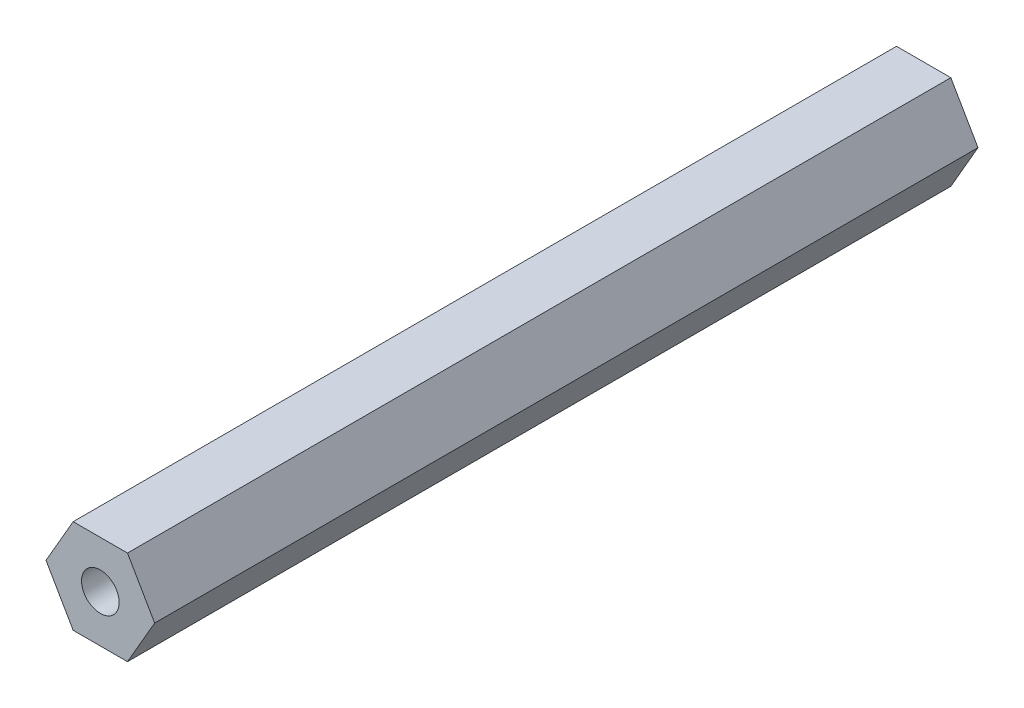
ISO-10303-21;
HEADER;
FILE_DESCRIPTION(('STEP AP214'),'2;1');
FILE_NAME('part.step','',(''),(''),'','','');
FILE_SCHEMA(('AUTOMOTIVE_DESIGN { 1 0 10303 214 1 1 1 1 }'));
ENDSEC;
DATA;
#1=APPLICATION_CONTEXT('core data for automotive mechanical design processes');
#2=APPLICATION_PROTOCOL_DEFINITION('international standard','automotive_design',2000,#1);
#3=PRODUCT_CONTEXT('',#1,'mechanical');
#4=PRODUCT('Part','Part','',(#3));
#5=PRODUCT_RELATED_PRODUCT_CATEGORY('part','',(#4));
#6=PRODUCT_DEFINITION_FORMATION('','',#4);
#7=PRODUCT_DEFINITION_CONTEXT('part definition',#1,'design');
#8=PRODUCT_DEFINITION('design','',#6,#7);
#9=PRODUCT_DEFINITION_SHAPE('','',#8);
#10=(LENGTH_UNIT() NAMED_UNIT(*) SI_UNIT(.MILLI.,.METRE.));
#11=(NAMED_UNIT(*) PLANE_ANGLE_UNIT() SI_UNIT($,.RADIAN.));
#12=(NAMED_UNIT(*) SI_UNIT($,.STERADIAN.) SOLID_ANGLE_UNIT());
#13=UNCERTAINTY_MEASURE_WITH_UNIT(LENGTH_MEASURE(1.E-05),#10,'distance_accuracy_value','');
#14=(GEOMETRIC_REPRESENTATION_CONTEXT(3) GLOBAL_UNCERTAINTY_ASSIGNED_CONTEXT((#13)) GLOBAL_UNIT_ASSIGNED_CONTEXT((#10,
#11,#12)) REPRESENTATION_CONTEXT('',''));
#15=CARTESIAN_POINT('',(0.,0.,0.));
#16=DIRECTION('',(0.,0.,1.));
#17=DIRECTION('',(1.,0.,0.));
#18=AXIS2_PLACEMENT_3D('',#15,#16,#17);
#19=CARTESIAN_POINT('',(0.,0.,111.125));
#20=DIRECTION('',(0.,0.,1.));
#21=DIRECTION('',(1.,0.,0.));
#22=AXIS2_PLACEMENT_3D('',#19,#20,#21);
#23=PLANE('',#22);
#24=DIRECTION('',(0.499999999999995,0.866025403784442,0.));
#25=VECTOR('',#24,1.);
#26=CARTESIAN_POINT('',(3.6661742093542,-6.91158159854264,111.125));
#27=LINE('',#26,#25);
#28=CARTESIAN_POINT('',(3.6661742093542,-6.91158159854264,111.125));
#29=VERTEX_POINT('',#28);
#30=CARTESIAN_POINT('',(7.33234841870825,-0.561581598542684,111.125));
#31=VERTEX_POINT('',#30);
#32=EDGE_CURVE('E150',#29,#31,#27,.T.);
#33=ORIENTED_EDGE('',*,*,#32,.T.);
#34=DIRECTION('',(-0.500000000000001,0.866025403784438,0.));
#35=VECTOR('',#34,1.);
#36=CARTESIAN_POINT('',(7.33234841870825,-0.561581598542684,111.125));
#37=LINE('',#36,#35);
#38=CARTESIAN_POINT('',(3.66617420935411,5.78841840145733,111.125));
#39=VERTEX_POINT('',#38);
#40=EDGE_CURVE('E98',#31,#39,#37,.T.);
#41=ORIENTED_EDGE('',*,*,#40,.T.);
#42=DIRECTION('',(-1.,0.,0.));
#43=VECTOR('',#42,1.);
#44=CARTESIAN_POINT('',(3.66617420935411,5.78841840145733,111.125));
#45=LINE('',#44,#43);
#46=CARTESIAN_POINT('',(-3.66617420935416,5.7884184014573,111.125));
#47=VERTEX_POINT('',#46);
#48=EDGE_CURVE('E111',#39,#47,#45,.T.);
#49=ORIENTED_EDGE('',*,*,#48,.T.);
#50=DIRECTION('',(-0.499999999999995,-0.866025403784442,0.));
#51=VECTOR('',#50,1.);
#52=CARTESIAN_POINT('',(-3.66617420935416,5.7884184014573,111.125));
#53=LINE('',#52,#51);
#54=CARTESIAN_POINT('',(-7.33234841870825,-0.561581598542735,111.125));
#55=VERTEX_POINT('',#54);
#56=EDGE_CURVE('E105',#47,#55,#53,.T.);
#57=ORIENTED_EDGE('',*,*,#56,.T.);
#58=DIRECTION('',(0.500000000000007,-0.866025403784434,0.));
#59=VECTOR('',#58,1.);
#60=CARTESIAN_POINT('',(-7.33234841870825,-0.561581598542735,111.125));
#61=LINE('',#60,#59);
#62=CARTESIAN_POINT('',(-3.66617420935407,-6.91158159854272,111.125));
#63=VERTEX_POINT('',#62);
#64=EDGE_CURVE('E109',#55,#63,#61,.T.);
#65=ORIENTED_EDGE('',*,*,#64,.T.);
#66=DIRECTION('',(1.,0.,0.));
#67=VECTOR('',#66,1.);
#68=CARTESIAN_POINT('',(-3.66617420935407,-6.91158159854272,111.125));
#69=LINE('',#68,#67);
#70=EDGE_CURVE('E61',#63,#29,#69,.T.);
#71=ORIENTED_EDGE('',*,*,#70,.T.);
#72=EDGE_LOOP('',(#33,#41,#49,#57,#65,#71));
#73=FACE_BOUND('',#72,.T.);
#74=CARTESIAN_POINT('',(0.,-0.561581598542684,111.125));
#75=DIRECTION('',(0.,0.,1.));
#76=DIRECTION('',(1.,0.,0.));
#77=AXIS2_PLACEMENT_3D('',#74,#75,#76);
#78=CIRCLE('',#77,2.54);
#79=CARTESIAN_POINT('',(2.54,-0.561581598542684,111.125));
#80=VERTEX_POINT('',#79);
#81=EDGE_CURVE('E138',#80,#80,#78,.T.);
#82=ORIENTED_EDGE('',*,*,#81,.F.);
#83=EDGE_LOOP('',(#82));
#84=FACE_BOUND('',#83,.T.);
#85=ADVANCED_FACE('F43',(#73,#84),#23,.T.);
#86=CARTESIAN_POINT('',(0.,0.,0.));
#87=DIRECTION('',(0.,0.,1.));
#88=DIRECTION('',(1.,0.,0.));
#89=AXIS2_PLACEMENT_3D('',#86,#87,#88);
#90=PLANE('',#89);
#91=DIRECTION('',(0.499999999999995,0.866025403784442,0.));
#92=VECTOR('',#91,1.);
#93=CARTESIAN_POINT('',(3.6661742093542,-6.91158159854264,0.));
#94=LINE('',#93,#92);
#95=CARTESIAN_POINT('',(3.6661742093542,-6.91158159854264,0.));
#96=VERTEX_POINT('',#95);
#97=CARTESIAN_POINT('',(7.33234841870825,-0.561581598542684,0.));
#98=VERTEX_POINT('',#97);
#99=EDGE_CURVE('E133',#96,#98,#94,.T.);
#100=ORIENTED_EDGE('',*,*,#99,.F.);
#101=DIRECTION('',(1.,0.,0.));
#102=VECTOR('',#101,1.);
#103=CARTESIAN_POINT('',(-3.66617420935407,-6.91158159854272,0.));
#104=LINE('',#103,#102);
#105=CARTESIAN_POINT('',(-3.66617420935407,-6.91158159854272,0.));
#106=VERTEX_POINT('',#105);
#107=EDGE_CURVE('E90',#106,#96,#104,.T.);
#108=ORIENTED_EDGE('',*,*,#107,.F.);
#109=DIRECTION('',(0.500000000000007,-0.866025403784434,0.));
#110=VECTOR('',#109,1.);
#111=CARTESIAN_POINT('',(-7.33234841870825,-0.561581598542735,0.));
#112=LINE('',#111,#110);
#113=CARTESIAN_POINT('',(-7.33234841870825,-0.561581598542735,0.));
#114=VERTEX_POINT('',#113);
#115=EDGE_CURVE('E84',#114,#106,#112,.T.);
#116=ORIENTED_EDGE('',*,*,#115,.F.);
#117=DIRECTION('',(-0.499999999999995,-0.866025403784442,0.));
#118=VECTOR('',#117,1.);
#119=CARTESIAN_POINT('',(-3.66617420935416,5.7884184014573,0.));
#120=LINE('',#119,#118);
#121=CARTESIAN_POINT('',(-3.66617420935416,5.7884184014573,0.));
#122=VERTEX_POINT('',#121);
#123=EDGE_CURVE('E120',#122,#114,#120,.T.);
#124=ORIENTED_EDGE('',*,*,#123,.F.);
#125=DIRECTION('',(-1.,0.,0.));
#126=VECTOR('',#125,1.);
#127=CARTESIAN_POINT('',(3.66617420935411,5.78841840145733,0.));
#128=LINE('',#127,#126);
#129=CARTESIAN_POINT('',(3.66617420935411,5.78841840145733,0.));
#130=VERTEX_POINT('',#129);
#131=EDGE_CURVE('E141',#130,#122,#128,.T.);
#132=ORIENTED_EDGE('',*,*,#131,.F.);
#133=DIRECTION('',(-0.500000000000001,0.866025403784438,0.));
#134=VECTOR('',#133,1.);
#135=CARTESIAN_POINT('',(7.33234841870825,-0.561581598542684,0.));
#136=LINE('',#135,#134);
#137=EDGE_CURVE('E137',#98,#130,#136,.T.);
#138=ORIENTED_EDGE('',*,*,#137,.F.);
#139=EDGE_LOOP('',(#100,#108,#116,#124,#132,#138));
#140=FACE_BOUND('',#139,.T.);
#141=CARTESIAN_POINT('',(0.,-0.561581598542684,0.));
#142=DIRECTION('',(0.,0.,1.));
#143=DIRECTION('',(1.,0.,0.));
#144=AXIS2_PLACEMENT_3D('',#141,#142,#143);
#145=CIRCLE('',#144,2.54);
#146=CARTESIAN_POINT('',(2.54,-0.561581598542684,0.));
#147=VERTEX_POINT('',#146);
#148=EDGE_CURVE('E265',#147,#147,#145,.T.);
#149=ORIENTED_EDGE('',*,*,#148,.T.);
#150=EDGE_LOOP('',(#149));
#151=FACE_BOUND('',#150,.T.);
#152=ADVANCED_FACE('F163',(#140,#151),#90,.F.);
#153=CARTESIAN_POINT('',(3.6661742093542,-6.91158159854264,111.125));
#154=DIRECTION('',(-0.866025403784441,0.499999999999995,0.));
#155=DIRECTION('',(-0.499999999999995,-0.866025403784442,0.));
#156=AXIS2_PLACEMENT_3D('',#153,#154,#155);
#157=PLANE('',#156);
#158=ORIENTED_EDGE('',*,*,#99,.T.);
#159=DIRECTION('',(0.,0.,-1.));
#160=VECTOR('',#159,1.);
#161=CARTESIAN_POINT('',(7.33234841870825,-0.561581598542684,111.125));
#162=LINE('',#161,#160);
#163=EDGE_CURVE('E11',#31,#98,#162,.T.);
#164=ORIENTED_EDGE('',*,*,#163,.F.);
#165=ORIENTED_EDGE('',*,*,#32,.F.);
#166=DIRECTION('',(0.,0.,-1.));
#167=VECTOR('',#166,1.);
#168=CARTESIAN_POINT('',(3.6661742093542,-6.91158159854264,111.125));
#169=LINE('',#168,#167);
#170=EDGE_CURVE('E129',#29,#96,#169,.T.);
#171=ORIENTED_EDGE('',*,*,#170,.T.);
#172=EDGE_LOOP('',(#158,#164,#165,#171));
#173=FACE_BOUND('',#172,.T.);
#174=ADVANCED_FACE('F45',(#173),#157,.F.);
#175=CARTESIAN_POINT('',(7.33234841870825,-0.561581598542684,111.125));
#176=DIRECTION('',(-0.866025403784438,-0.500000000000001,0.));
#177=DIRECTION('',(0.500000000000001,-0.866025403784438,0.));
#178=AXIS2_PLACEMENT_3D('',#175,#176,#177);
#179=PLANE('',#178);
#180=ORIENTED_EDGE('',*,*,#137,.T.);
#181=DIRECTION('',(0.,0.,-1.));
#182=VECTOR('',#181,1.);
#183=CARTESIAN_POINT('',(3.66617420935411,5.78841840145733,111.125));
#184=LINE('',#183,#182);
#185=EDGE_CURVE('E53',#39,#130,#184,.T.);
#186=ORIENTED_EDGE('',*,*,#185,.F.);
#187=ORIENTED_EDGE('',*,*,#40,.F.);
#188=ORIENTED_EDGE('',*,*,#163,.T.);
#189=EDGE_LOOP('',(#180,#186,#187,#188));
#190=FACE_BOUND('',#189,.T.);
#191=ADVANCED_FACE('F188',(#190),#179,.F.);
#192=CARTESIAN_POINT('',(3.66617420935411,5.78841840145733,111.125));
#193=DIRECTION('',(0.,-1.,0.));
#194=DIRECTION('',(1.,0.,0.));
#195=AXIS2_PLACEMENT_3D('',#192,#193,#194);
#196=PLANE('',#195);
#197=ORIENTED_EDGE('',*,*,#131,.T.);
#198=DIRECTION('',(0.,0.,-1.));
#199=VECTOR('',#198,1.);
#200=CARTESIAN_POINT('',(-3.66617420935416,5.7884184014573,111.125));
#201=LINE('',#200,#199);
#202=EDGE_CURVE('E122',#47,#122,#201,.T.);
#203=ORIENTED_EDGE('',*,*,#202,.F.);
#204=ORIENTED_EDGE('',*,*,#48,.F.);
#205=ORIENTED_EDGE('',*,*,#185,.T.);
#206=EDGE_LOOP('',(#197,#203,#204,#205));
#207=FACE_BOUND('',#206,.T.);
#208=ADVANCED_FACE('F160',(#207),#196,.F.);
#209=CARTESIAN_POINT('',(-3.66617420935416,5.7884184014573,111.125));
#210=DIRECTION('',(0.866025403784442,-0.499999999999995,0.));
#211=DIRECTION('',(0.499999999999995,0.866025403784442,0.));
#212=AXIS2_PLACEMENT_3D('',#209,#210,#211);
#213=PLANE('',#212);
#214=ORIENTED_EDGE('',*,*,#123,.T.);
#215=DIRECTION('',(0.,0.,-1.));
#216=VECTOR('',#215,1.);
#217=CARTESIAN_POINT('',(-7.33234841870825,-0.561581598542735,111.125));
#218=LINE('',#217,#216);
#219=EDGE_CURVE('E117',#55,#114,#218,.T.);
#220=ORIENTED_EDGE('',*,*,#219,.F.);
#221=ORIENTED_EDGE('',*,*,#56,.F.);
#222=ORIENTED_EDGE('',*,*,#202,.T.);
#223=EDGE_LOOP('',(#214,#220,#221,#222));
#224=FACE_BOUND('',#223,.T.);
#225=ADVANCED_FACE('F118',(#224),#213,.F.);
#226=CARTESIAN_POINT('',(-7.33234841870825,-0.561581598542735,111.125));
#227=DIRECTION('',(0.866025403784434,0.500000000000007,0.));
#228=DIRECTION('',(-0.500000000000007,0.866025403784435,0.));
#229=AXIS2_PLACEMENT_3D('',#226,#227,#228);
#230=PLANE('',#229);
#231=ORIENTED_EDGE('',*,*,#115,.T.);
#232=DIRECTION('',(0.,0.,-1.));
#233=VECTOR('',#232,1.);
#234=CARTESIAN_POINT('',(-3.66617420935407,-6.91158159854272,111.125));
#235=LINE('',#234,#233);
#236=EDGE_CURVE('E123',#63,#106,#235,.T.);
#237=ORIENTED_EDGE('',*,*,#236,.F.);
#238=ORIENTED_EDGE('',*,*,#64,.F.);
#239=ORIENTED_EDGE('',*,*,#219,.T.);
#240=EDGE_LOOP('',(#231,#237,#238,#239));
#241=FACE_BOUND('',#240,.T.);
#242=ADVANCED_FACE('F125',(#241),#230,.F.);
#243=CARTESIAN_POINT('',(-3.66617420935407,-6.91158159854272,111.125));
#244=DIRECTION('',(0.,1.,0.));
#245=DIRECTION('',(-1.,0.,0.));
#246=AXIS2_PLACEMENT_3D('',#243,#244,#245);
#247=PLANE('',#246);
#248=ORIENTED_EDGE('',*,*,#107,.T.);
#249=ORIENTED_EDGE('',*,*,#170,.F.);
#250=ORIENTED_EDGE('',*,*,#70,.F.);
#251=ORIENTED_EDGE('',*,*,#236,.T.);
#252=EDGE_LOOP('',(#248,#249,#250,#251));
#253=FACE_BOUND('',#252,.T.);
#254=ADVANCED_FACE('F168',(#253),#247,.F.);
#255=CARTESIAN_POINT('',(0.,-0.561581598542684,111.125));
#256=DIRECTION('',(0.,0.,-1.));
#257=DIRECTION('',(-1.,0.,0.));
#258=AXIS2_PLACEMENT_3D('',#255,#256,#257);
#259=CYLINDRICAL_SURFACE('',#258,2.54);
#260=ORIENTED_EDGE('',*,*,#81,.T.);
#261=EDGE_LOOP('',(#260));
#262=FACE_BOUND('',#261,.T.);
#263=ORIENTED_EDGE('',*,*,#148,.F.);
#264=EDGE_LOOP('',(#263));
#265=FACE_BOUND('',#264,.T.);
#266=ADVANCED_FACE('F170',(#262,#265),#259,.F.);
#267=CLOSED_SHELL('',(#85,#152,#174,#191,#208,#225,#242,#254,#266));
#268=MANIFOLD_SOLID_BREP('B2',#267);
#269=ADVANCED_BREP_SHAPE_REPRESENTATION('',(#18,#268),#14);
#270=SHAPE_DEFINITION_REPRESENTATION(#9,#269);
ENDSEC;
END-ISO-10303-21;
